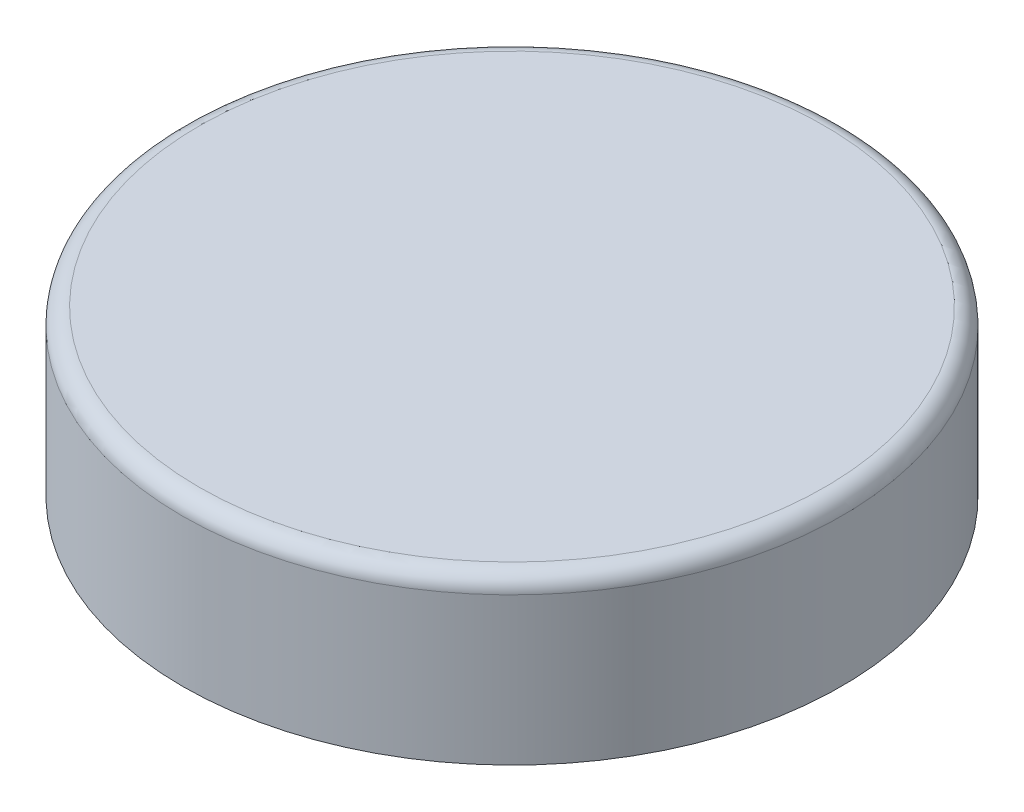
ISO-10303-21;
HEADER;
FILE_DESCRIPTION(('STEP AP214'),'2;1');
FILE_NAME('part.step','',(''),(''),'','','');
FILE_SCHEMA(('AUTOMOTIVE_DESIGN { 1 0 10303 214 1 1 1 1 }'));
ENDSEC;
DATA;
#1=APPLICATION_CONTEXT('core data for automotive mechanical design processes');
#2=APPLICATION_PROTOCOL_DEFINITION('international standard','automotive_design',2000,#1);
#3=PRODUCT_CONTEXT('',#1,'mechanical');
#4=PRODUCT('Part','Part','',(#3));
#5=PRODUCT_RELATED_PRODUCT_CATEGORY('part','',(#4));
#6=PRODUCT_DEFINITION_FORMATION('','',#4);
#7=PRODUCT_DEFINITION_CONTEXT('part definition',#1,'design');
#8=PRODUCT_DEFINITION('design','',#6,#7);
#9=PRODUCT_DEFINITION_SHAPE('','',#8);
#10=(LENGTH_UNIT() NAMED_UNIT(*) SI_UNIT(.MILLI.,.METRE.));
#11=(NAMED_UNIT(*) PLANE_ANGLE_UNIT() SI_UNIT($,.RADIAN.));
#12=(NAMED_UNIT(*) SI_UNIT($,.STERADIAN.) SOLID_ANGLE_UNIT());
#13=UNCERTAINTY_MEASURE_WITH_UNIT(LENGTH_MEASURE(1.E-05),#10,'distance_accuracy_value','');
#14=(GEOMETRIC_REPRESENTATION_CONTEXT(3) GLOBAL_UNCERTAINTY_ASSIGNED_CONTEXT((#13)) GLOBAL_UNIT_ASSIGNED_CONTEXT((#10,
#11,#12)) REPRESENTATION_CONTEXT('',''));
#15=CARTESIAN_POINT('',(0.,0.,0.));
#16=DIRECTION('',(0.,0.,1.));
#17=DIRECTION('',(1.,0.,0.));
#18=AXIS2_PLACEMENT_3D('',#15,#16,#17);
#19=CARTESIAN_POINT('',(0.,2.95,0.));
#20=DIRECTION('',(0.,-1.,0.));
#21=DIRECTION('',(0.,0.,-1.));
#22=AXIS2_PLACEMENT_3D('',#19,#20,#21);
#23=CYLINDRICAL_SURFACE('',#22,4.625);
#24=CARTESIAN_POINT('',(0.,0.,0.));
#25=DIRECTION('',(0.,1.,0.));
#26=DIRECTION('',(0.,0.,1.));
#27=AXIS2_PLACEMENT_3D('',#24,#25,#26);
#28=CIRCLE('',#27,4.625);
#29=CARTESIAN_POINT('',(0.,0.,4.625));
#30=VERTEX_POINT('',#29);
#31=EDGE_CURVE('E59',#30,#30,#28,.T.);
#32=ORIENTED_EDGE('',*,*,#31,.F.);
#33=EDGE_LOOP('',(#32));
#34=FACE_BOUND('',#33,.T.);
#35=CARTESIAN_POINT('',(0.,2.55,0.));
#36=DIRECTION('',(0.,1.,0.));
#37=DIRECTION('',(0.,0.,1.));
#38=AXIS2_PLACEMENT_3D('',#35,#36,#37);
#39=CIRCLE('',#38,4.625);
#40=CARTESIAN_POINT('',(0.,2.55,4.625));
#41=VERTEX_POINT('',#40);
#42=EDGE_CURVE('E65',#41,#41,#39,.T.);
#43=ORIENTED_EDGE('',*,*,#42,.T.);
#44=EDGE_LOOP('',(#43));
#45=FACE_BOUND('',#44,.T.);
#46=ADVANCED_FACE('F41',(#34,#45),#23,.F.);
#47=CARTESIAN_POINT('',(0.,2.95,0.));
#48=DIRECTION('',(0.,-1.,0.));
#49=DIRECTION('',(0.,0.,-1.));
#50=AXIS2_PLACEMENT_3D('',#47,#48,#49);
#51=CYLINDRICAL_SURFACE('',#50,5.925);
#52=CARTESIAN_POINT('',(0.,2.65,0.));
#53=DIRECTION('',(0.,1.,0.));
#54=DIRECTION('',(0.,0.,1.));
#55=AXIS2_PLACEMENT_3D('',#52,#53,#54);
#56=CIRCLE('',#55,5.925);
#57=CARTESIAN_POINT('',(0.,2.65,5.925));
#58=VERTEX_POINT('',#57);
#59=EDGE_CURVE('E10',#58,#58,#56,.F.);
#60=ORIENTED_EDGE('',*,*,#59,.T.);
#61=EDGE_LOOP('',(#60));
#62=FACE_BOUND('',#61,.T.);
#63=CARTESIAN_POINT('',(0.,0.,0.));
#64=DIRECTION('',(0.,1.,0.));
#65=DIRECTION('',(0.,0.,1.));
#66=AXIS2_PLACEMENT_3D('',#63,#64,#65);
#67=CIRCLE('',#66,5.925);
#68=CARTESIAN_POINT('',(0.,0.,5.925));
#69=VERTEX_POINT('',#68);
#70=EDGE_CURVE('E54',#69,#69,#67,.T.);
#71=ORIENTED_EDGE('',*,*,#70,.T.);
#72=EDGE_LOOP('',(#71));
#73=FACE_BOUND('',#72,.T.);
#74=ADVANCED_FACE('F85',(#62,#73),#51,.T.);
#75=CARTESIAN_POINT('',(0.,2.95,0.));
#76=DIRECTION('',(0.,1.,0.));
#77=DIRECTION('',(0.,0.,1.));
#78=AXIS2_PLACEMENT_3D('',#75,#76,#77);
#79=PLANE('',#78);
#80=CARTESIAN_POINT('',(0.,2.95,0.));
#81=DIRECTION('',(0.,1.,0.));
#82=DIRECTION('',(0.,0.,1.));
#83=AXIS2_PLACEMENT_3D('',#80,#81,#82);
#84=CIRCLE('',#83,5.625);
#85=CARTESIAN_POINT('',(0.,2.95,5.625));
#86=VERTEX_POINT('',#85);
#87=EDGE_CURVE('E49',#86,#86,#84,.T.);
#88=ORIENTED_EDGE('',*,*,#87,.T.);
#89=EDGE_LOOP('',(#88));
#90=FACE_BOUND('',#89,.T.);
#91=ADVANCED_FACE('F80',(#90),#79,.T.);
#92=CARTESIAN_POINT('',(0.,0.,0.));
#93=DIRECTION('',(0.,1.,0.));
#94=DIRECTION('',(0.,0.,1.));
#95=AXIS2_PLACEMENT_3D('',#92,#93,#94);
#96=PLANE('',#95);
#97=ORIENTED_EDGE('',*,*,#31,.T.);
#98=EDGE_LOOP('',(#97));
#99=FACE_BOUND('',#98,.T.);
#100=ORIENTED_EDGE('',*,*,#70,.F.);
#101=EDGE_LOOP('',(#100));
#102=FACE_BOUND('',#101,.T.);
#103=ADVANCED_FACE('F73',(#99,#102),#96,.F.);
#104=CARTESIAN_POINT('',(0.,2.55,0.));
#105=DIRECTION('',(0.,1.,0.));
#106=DIRECTION('',(0.,0.,1.));
#107=AXIS2_PLACEMENT_3D('',#104,#105,#106);
#108=PLANE('',#107);
#109=ORIENTED_EDGE('',*,*,#42,.F.);
#110=EDGE_LOOP('',(#109));
#111=FACE_BOUND('',#110,.T.);
#112=ADVANCED_FACE('F71',(#111),#108,.F.);
#113=CARTESIAN_POINT('',(0.,2.65,0.));
#114=DIRECTION('',(0.,1.,0.));
#115=DIRECTION('',(0.,0.,1.));
#116=AXIS2_PLACEMENT_3D('',#113,#114,#115);
#117=TOROIDAL_SURFACE('',#116,5.625,0.3);
#118=ORIENTED_EDGE('',*,*,#59,.F.);
#119=EDGE_LOOP('',(#118));
#120=FACE_BOUND('',#119,.T.);
#121=ORIENTED_EDGE('',*,*,#87,.F.);
#122=EDGE_LOOP('',(#121));
#123=FACE_BOUND('',#122,.T.);
#124=ADVANCED_FACE('F43',(#120,#123),#117,.T.);
#125=CLOSED_SHELL('',(#46,#74,#91,#103,#112,#124));
#126=MANIFOLD_SOLID_BREP('B2',#125);
#127=ADVANCED_BREP_SHAPE_REPRESENTATION('',(#18,#126),#14);
#128=SHAPE_DEFINITION_REPRESENTATION(#9,#127);
ENDSEC;
END-ISO-10303-21;
